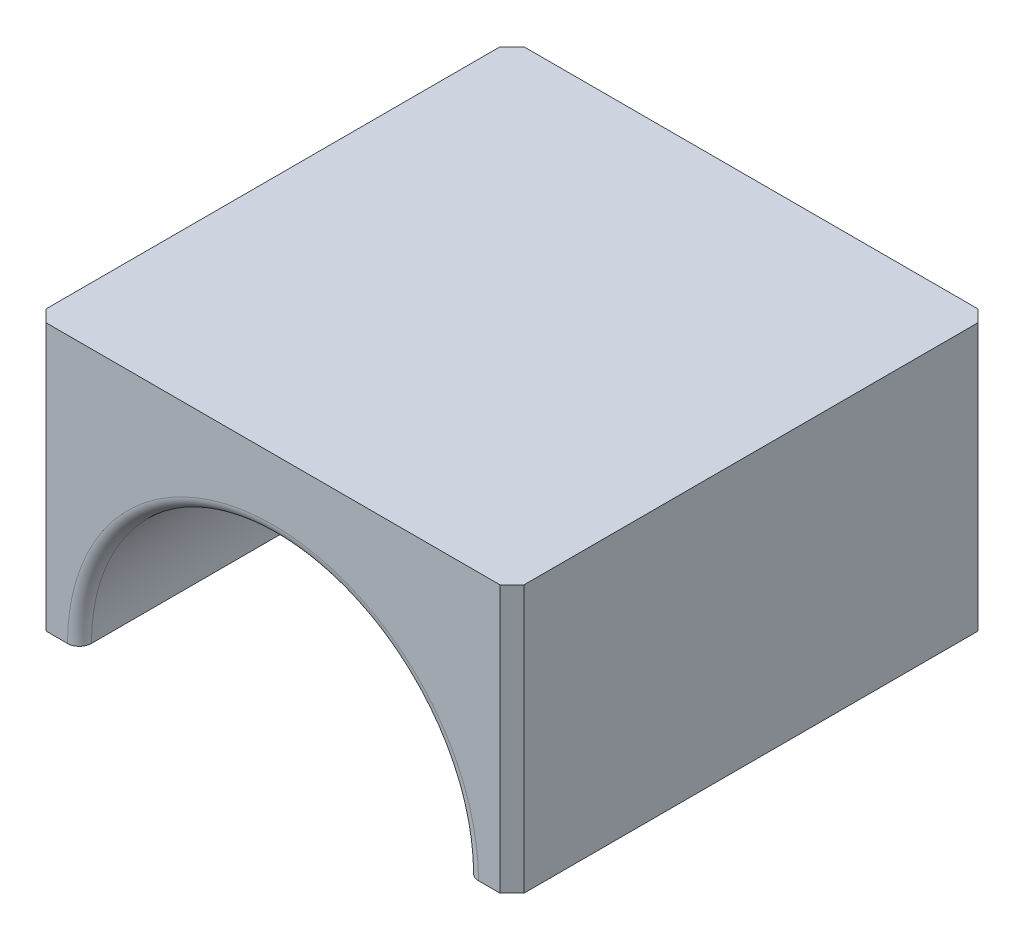
ISO-10303-21;
HEADER;
FILE_DESCRIPTION(('STEP AP214'),'2;1');
FILE_NAME('part.step','',(''),(''),'','','');
FILE_SCHEMA(('AUTOMOTIVE_DESIGN { 1 0 10303 214 1 1 1 1 }'));
ENDSEC;
DATA;
#1=APPLICATION_CONTEXT('core data for automotive mechanical design processes');
#2=APPLICATION_PROTOCOL_DEFINITION('international standard','automotive_design',2000,#1);
#3=PRODUCT_CONTEXT('',#1,'mechanical');
#4=PRODUCT('Part','Part','',(#3));
#5=PRODUCT_RELATED_PRODUCT_CATEGORY('part','',(#4));
#6=PRODUCT_DEFINITION_FORMATION('','',#4);
#7=PRODUCT_DEFINITION_CONTEXT('part definition',#1,'design');
#8=PRODUCT_DEFINITION('design','',#6,#7);
#9=PRODUCT_DEFINITION_SHAPE('','',#8);
#10=(LENGTH_UNIT() NAMED_UNIT(*) SI_UNIT(.MILLI.,.METRE.));
#11=(NAMED_UNIT(*) PLANE_ANGLE_UNIT() SI_UNIT($,.RADIAN.));
#12=(NAMED_UNIT(*) SI_UNIT($,.STERADIAN.) SOLID_ANGLE_UNIT());
#13=UNCERTAINTY_MEASURE_WITH_UNIT(LENGTH_MEASURE(1.E-05),#10,'distance_accuracy_value','');
#14=(GEOMETRIC_REPRESENTATION_CONTEXT(3) GLOBAL_UNCERTAINTY_ASSIGNED_CONTEXT((#13)) GLOBAL_UNIT_ASSIGNED_CONTEXT((#10,
#11,#12)) REPRESENTATION_CONTEXT('',''));
#15=CARTESIAN_POINT('',(0.,0.,0.));
#16=DIRECTION('',(0.,0.,1.));
#17=DIRECTION('',(1.,0.,0.));
#18=AXIS2_PLACEMENT_3D('',#15,#16,#17);
#19=CARTESIAN_POINT('',(10.,1.5875,20.));
#20=DIRECTION('',(-1.,0.,0.));
#21=DIRECTION('',(0.,-1.,0.));
#22=AXIS2_PLACEMENT_3D('',#19,#20,#21);
#23=PLANE('',#22);
#24=DIRECTION('',(0.,0.,-1.));
#25=VECTOR('',#24,1.);
#26=CARTESIAN_POINT('',(10.,1.5875,20.));
#27=LINE('',#26,#25);
#28=CARTESIAN_POINT('',(10.,1.5875,19.5));
#29=VERTEX_POINT('',#28);
#30=CARTESIAN_POINT('',(10.,1.5875,0.500000000000004));
#31=VERTEX_POINT('',#30);
#32=EDGE_CURVE('E156',#29,#31,#27,.T.);
#33=ORIENTED_EDGE('',*,*,#32,.F.);
#34=DIRECTION('',(0.,-1.,0.));
#35=VECTOR('',#34,1.);
#36=CARTESIAN_POINT('',(9.99999999999999,-9.5875,19.5));
#37=LINE('',#36,#35);
#38=CARTESIAN_POINT('',(10.,-9.5875,19.5));
#39=VERTEX_POINT('',#38);
#40=EDGE_CURVE('E62',#29,#39,#37,.T.);
#41=ORIENTED_EDGE('',*,*,#40,.T.);
#42=DIRECTION('',(0.,0.,-1.));
#43=VECTOR('',#42,1.);
#44=CARTESIAN_POINT('',(10.,-9.5875,20.));
#45=LINE('',#44,#43);
#46=CARTESIAN_POINT('',(10.,-9.5875,0.500000000000004));
#47=VERTEX_POINT('',#46);
#48=EDGE_CURVE('E150',#39,#47,#45,.T.);
#49=ORIENTED_EDGE('',*,*,#48,.T.);
#50=DIRECTION('',(0.,1.,0.));
#51=VECTOR('',#50,1.);
#52=CARTESIAN_POINT('',(10.,1.5875,0.500000000000004));
#53=LINE('',#52,#51);
#54=EDGE_CURVE('E200',#47,#31,#53,.T.);
#55=ORIENTED_EDGE('',*,*,#54,.T.);
#56=EDGE_LOOP('',(#33,#41,#49,#55));
#57=FACE_BOUND('',#56,.T.);
#58=ADVANCED_FACE('F40',(#57),#23,.F.);
#59=CARTESIAN_POINT('',(-10.,1.5875,20.));
#60=DIRECTION('',(0.,-1.,0.));
#61=DIRECTION('',(0.,0.,-1.));
#62=AXIS2_PLACEMENT_3D('',#59,#60,#61);
#63=PLANE('',#62);
#64=DIRECTION('',(0.,0.,-1.));
#65=VECTOR('',#64,1.);
#66=CARTESIAN_POINT('',(-10.,1.5875,20.));
#67=LINE('',#66,#65);
#68=CARTESIAN_POINT('',(-10.,1.5875,19.5));
#69=VERTEX_POINT('',#68);
#70=CARTESIAN_POINT('',(-10.,1.5875,0.500000000000004));
#71=VERTEX_POINT('',#70);
#72=EDGE_CURVE('E160',#69,#71,#67,.T.);
#73=ORIENTED_EDGE('',*,*,#72,.F.);
#74=DIRECTION('',(0.707106781186548,0.,0.707106781186548));
#75=VECTOR('',#74,1.);
#76=CARTESIAN_POINT('',(-9.5,1.5875,20.));
#77=LINE('',#76,#75);
#78=CARTESIAN_POINT('',(-9.5,1.5875,20.));
#79=VERTEX_POINT('',#78);
#80=EDGE_CURVE('E194',#69,#79,#77,.T.);
#81=ORIENTED_EDGE('',*,*,#80,.T.);
#82=DIRECTION('',(-1.,0.,0.));
#83=VECTOR('',#82,1.);
#84=CARTESIAN_POINT('',(-10.,1.5875,20.));
#85=LINE('',#84,#83);
#86=CARTESIAN_POINT('',(9.5,1.5875,20.));
#87=VERTEX_POINT('',#86);
#88=EDGE_CURVE('E212',#87,#79,#85,.T.);
#89=ORIENTED_EDGE('',*,*,#88,.F.);
#90=DIRECTION('',(0.707106781186548,0.,-0.707106781186547));
#91=VECTOR('',#90,1.);
#92=CARTESIAN_POINT('',(9.5,1.5875,20.));
#93=LINE('',#92,#91);
#94=EDGE_CURVE('E190',#87,#29,#93,.T.);
#95=ORIENTED_EDGE('',*,*,#94,.T.);
#96=ORIENTED_EDGE('',*,*,#32,.T.);
#97=DIRECTION('',(0.707106781186551,0.,0.707106781186545));
#98=VECTOR('',#97,1.);
#99=CARTESIAN_POINT('',(10.,1.5875,0.500000000000004));
#100=LINE('',#99,#98);
#101=CARTESIAN_POINT('',(9.49999999999999,1.5875,0.));
#102=VERTEX_POINT('',#101);
#103=EDGE_CURVE('E188',#31,#102,#100,.F.);
#104=ORIENTED_EDGE('',*,*,#103,.T.);
#105=DIRECTION('',(-1.,0.,0.));
#106=VECTOR('',#105,1.);
#107=CARTESIAN_POINT('',(-10.,1.5875,0.));
#108=LINE('',#107,#106);
#109=CARTESIAN_POINT('',(-9.49999999999999,1.5875,0.));
#110=VERTEX_POINT('',#109);
#111=EDGE_CURVE('E226',#102,#110,#108,.T.);
#112=ORIENTED_EDGE('',*,*,#111,.T.);
#113=DIRECTION('',(0.70710678118655,0.,-0.707106781186545));
#114=VECTOR('',#113,1.);
#115=CARTESIAN_POINT('',(-10.,1.5875,0.500000000000004));
#116=LINE('',#115,#114);
#117=EDGE_CURVE('E192',#110,#71,#116,.F.);
#118=ORIENTED_EDGE('',*,*,#117,.T.);
#119=EDGE_LOOP('',(#73,#81,#89,#95,#96,#104,#112,#118));
#120=FACE_BOUND('',#119,.T.);
#121=ADVANCED_FACE('F207',(#120),#63,.F.);
#122=CARTESIAN_POINT('',(-10.,-1.5875,20.));
#123=DIRECTION('',(1.,0.,0.));
#124=DIRECTION('',(0.,0.,-1.));
#125=AXIS2_PLACEMENT_3D('',#122,#123,#124);
#126=PLANE('',#125);
#127=DIRECTION('',(0.,0.,-1.));
#128=VECTOR('',#127,1.);
#129=CARTESIAN_POINT('',(-10.,-9.5875,20.));
#130=LINE('',#129,#128);
#131=CARTESIAN_POINT('',(-10.,-9.5875,19.5));
#132=VERTEX_POINT('',#131);
#133=CARTESIAN_POINT('',(-10.,-9.5875,0.500000000000004));
#134=VERTEX_POINT('',#133);
#135=EDGE_CURVE('E233',#132,#134,#130,.T.);
#136=ORIENTED_EDGE('',*,*,#135,.F.);
#137=DIRECTION('',(0.,1.,0.));
#138=VECTOR('',#137,1.);
#139=CARTESIAN_POINT('',(-10.,1.5875,19.5));
#140=LINE('',#139,#138);
#141=EDGE_CURVE('E186',#132,#69,#140,.T.);
#142=ORIENTED_EDGE('',*,*,#141,.T.);
#143=ORIENTED_EDGE('',*,*,#72,.T.);
#144=DIRECTION('',(0.,-1.,0.));
#145=VECTOR('',#144,1.);
#146=CARTESIAN_POINT('',(-10.,-1.5875,0.500000000000004));
#147=LINE('',#146,#145);
#148=EDGE_CURVE('E183',#71,#134,#147,.T.);
#149=ORIENTED_EDGE('',*,*,#148,.T.);
#150=EDGE_LOOP('',(#136,#142,#143,#149));
#151=FACE_BOUND('',#150,.T.);
#152=ADVANCED_FACE('F239',(#151),#126,.F.);
#153=CARTESIAN_POINT('',(-10.,-9.5875,20.));
#154=DIRECTION('',(0.,1.,0.));
#155=DIRECTION('',(0.,0.,1.));
#156=AXIS2_PLACEMENT_3D('',#153,#154,#155);
#157=PLANE('',#156);
#158=DIRECTION('',(1.,0.,0.));
#159=VECTOR('',#158,1.);
#160=CARTESIAN_POINT('',(-10.,-9.5875,20.));
#161=LINE('',#160,#159);
#162=CARTESIAN_POINT('',(-9.5,-9.5875,20.));
#163=VERTEX_POINT('',#162);
#164=CARTESIAN_POINT('',(-8.6,-9.5875,20.));
#165=VERTEX_POINT('',#164);
#166=EDGE_CURVE('E220',#163,#165,#161,.T.);
#167=ORIENTED_EDGE('',*,*,#166,.F.);
#168=DIRECTION('',(-0.707106781186548,0.,-0.707106781186548));
#169=VECTOR('',#168,1.);
#170=CARTESIAN_POINT('',(-9.5,-9.5875,20.));
#171=LINE('',#170,#169);
#172=EDGE_CURVE('E181',#163,#132,#171,.T.);
#173=ORIENTED_EDGE('',*,*,#172,.T.);
#174=ORIENTED_EDGE('',*,*,#135,.T.);
#175=DIRECTION('',(-0.70710678118655,0.,0.707106781186545));
#176=VECTOR('',#175,1.);
#177=CARTESIAN_POINT('',(-10.,-9.5875,0.500000000000004));
#178=LINE('',#177,#176);
#179=CARTESIAN_POINT('',(-9.49999999999999,-9.5875,0.));
#180=VERTEX_POINT('',#179);
#181=EDGE_CURVE('E179',#134,#180,#178,.F.);
#182=ORIENTED_EDGE('',*,*,#181,.T.);
#183=DIRECTION('',(1.,0.,0.));
#184=VECTOR('',#183,1.);
#185=CARTESIAN_POINT('',(-10.,-9.5875,0.));
#186=LINE('',#185,#184);
#187=CARTESIAN_POINT('',(-8.6,-9.5875,0.));
#188=VERTEX_POINT('',#187);
#189=EDGE_CURVE('E228',#180,#188,#186,.T.);
#190=ORIENTED_EDGE('',*,*,#189,.T.);
#191=CARTESIAN_POINT('',(-8.6,-9.5875,0.5));
#192=DIRECTION('',(0.,1.,0.));
#193=DIRECTION('',(0.,0.,1.));
#194=AXIS2_PLACEMENT_3D('',#191,#192,#193);
#195=CIRCLE('',#194,0.5);
#196=CARTESIAN_POINT('',(-8.1,-9.5875,0.5));
#197=VERTEX_POINT('',#196);
#198=EDGE_CURVE('E169',#188,#197,#195,.F.);
#199=ORIENTED_EDGE('',*,*,#198,.T.);
#200=DIRECTION('',(0.,0.,-1.));
#201=VECTOR('',#200,1.);
#202=CARTESIAN_POINT('',(-8.1,-9.5875,20.));
#203=LINE('',#202,#201);
#204=CARTESIAN_POINT('',(-8.1,-9.5875,19.5));
#205=VERTEX_POINT('',#204);
#206=EDGE_CURVE('E149',#205,#197,#203,.T.);
#207=ORIENTED_EDGE('',*,*,#206,.F.);
#208=CARTESIAN_POINT('',(-8.6,-9.5875,19.5));
#209=DIRECTION('',(0.,1.,0.));
#210=DIRECTION('',(0.,0.,1.));
#211=AXIS2_PLACEMENT_3D('',#208,#209,#210);
#212=CIRCLE('',#211,0.5);
#213=EDGE_CURVE('E155',#205,#165,#212,.F.);
#214=ORIENTED_EDGE('',*,*,#213,.T.);
#215=EDGE_LOOP('',(#167,#173,#174,#182,#190,#199,#207,#214));
#216=FACE_BOUND('',#215,.T.);
#217=ADVANCED_FACE('F249',(#216),#157,.F.);
#218=CARTESIAN_POINT('',(0.,-9.5875,20.));
#219=DIRECTION('',(0.,0.,-1.));
#220=DIRECTION('',(-1.,0.,0.));
#221=AXIS2_PLACEMENT_3D('',#218,#219,#220);
#222=CYLINDRICAL_SURFACE('',#221,8.1);
#223=ORIENTED_EDGE('',*,*,#206,.T.);
#224=CARTESIAN_POINT('',(0.,-9.5875,0.5));
#225=DIRECTION('',(0.,0.,1.));
#226=DIRECTION('',(1.,0.,0.));
#227=AXIS2_PLACEMENT_3D('',#224,#225,#226);
#228=CIRCLE('',#227,8.1);
#229=CARTESIAN_POINT('',(8.1,-9.5875,0.5));
#230=VERTEX_POINT('',#229);
#231=EDGE_CURVE('E140',#197,#230,#228,.F.);
#232=ORIENTED_EDGE('',*,*,#231,.T.);
#233=DIRECTION('',(0.,0.,-1.));
#234=VECTOR('',#233,1.);
#235=CARTESIAN_POINT('',(8.1,-9.5875,20.));
#236=LINE('',#235,#234);
#237=CARTESIAN_POINT('',(8.1,-9.5875,19.5));
#238=VERTEX_POINT('',#237);
#239=EDGE_CURVE('E132',#238,#230,#236,.T.);
#240=ORIENTED_EDGE('',*,*,#239,.F.);
#241=CARTESIAN_POINT('',(0.,-9.5875,19.5));
#242=DIRECTION('',(0.,0.,1.));
#243=DIRECTION('',(1.,0.,0.));
#244=AXIS2_PLACEMENT_3D('',#241,#242,#243);
#245=CIRCLE('',#244,8.1);
#246=EDGE_CURVE('E146',#238,#205,#245,.T.);
#247=ORIENTED_EDGE('',*,*,#246,.T.);
#248=EDGE_LOOP('',(#223,#232,#240,#247));
#249=FACE_BOUND('',#248,.T.);
#250=ADVANCED_FACE('F145',(#249),#222,.F.);
#251=CARTESIAN_POINT('',(8.1,-9.5875,20.));
#252=DIRECTION('',(0.,1.,0.));
#253=DIRECTION('',(0.,0.,1.));
#254=AXIS2_PLACEMENT_3D('',#251,#252,#253);
#255=PLANE('',#254);
#256=ORIENTED_EDGE('',*,*,#48,.F.);
#257=DIRECTION('',(-0.707106781186548,0.,0.707106781186547));
#258=VECTOR('',#257,1.);
#259=CARTESIAN_POINT('',(9.49999999999999,-9.58750000000001,20.));
#260=LINE('',#259,#258);
#261=CARTESIAN_POINT('',(9.49999999999999,-9.5875,20.));
#262=VERTEX_POINT('',#261);
#263=EDGE_CURVE('E11',#39,#262,#260,.T.);
#264=ORIENTED_EDGE('',*,*,#263,.T.);
#265=DIRECTION('',(1.,0.,0.));
#266=VECTOR('',#265,1.);
#267=CARTESIAN_POINT('',(8.1,-9.5875,20.));
#268=LINE('',#267,#266);
#269=CARTESIAN_POINT('',(8.6,-9.5875,20.));
#270=VERTEX_POINT('',#269);
#271=EDGE_CURVE('E134',#270,#262,#268,.T.);
#272=ORIENTED_EDGE('',*,*,#271,.F.);
#273=CARTESIAN_POINT('',(8.6,-9.5875,19.5));
#274=DIRECTION('',(0.,1.,0.));
#275=DIRECTION('',(0.,0.,1.));
#276=AXIS2_PLACEMENT_3D('',#273,#274,#275);
#277=CIRCLE('',#276,0.5);
#278=EDGE_CURVE('E129',#270,#238,#277,.F.);
#279=ORIENTED_EDGE('',*,*,#278,.T.);
#280=ORIENTED_EDGE('',*,*,#239,.T.);
#281=CARTESIAN_POINT('',(8.6,-9.5875,0.5));
#282=DIRECTION('',(0.,1.,0.));
#283=DIRECTION('',(0.,0.,1.));
#284=AXIS2_PLACEMENT_3D('',#281,#282,#283);
#285=CIRCLE('',#284,0.5);
#286=CARTESIAN_POINT('',(8.6,-9.5875,0.));
#287=VERTEX_POINT('',#286);
#288=EDGE_CURVE('E139',#230,#287,#285,.F.);
#289=ORIENTED_EDGE('',*,*,#288,.T.);
#290=DIRECTION('',(1.,0.,0.));
#291=VECTOR('',#290,1.);
#292=CARTESIAN_POINT('',(8.1,-9.5875,0.));
#293=LINE('',#292,#291);
#294=CARTESIAN_POINT('',(9.49999999999999,-9.5875,0.));
#295=VERTEX_POINT('',#294);
#296=EDGE_CURVE('E230',#287,#295,#293,.T.);
#297=ORIENTED_EDGE('',*,*,#296,.T.);
#298=DIRECTION('',(-0.707106781186551,0.,-0.707106781186545));
#299=VECTOR('',#298,1.);
#300=CARTESIAN_POINT('',(10.,-9.5875,0.500000000000007));
#301=LINE('',#300,#299);
#302=EDGE_CURVE('E49',#295,#47,#301,.F.);
#303=ORIENTED_EDGE('',*,*,#302,.T.);
#304=EDGE_LOOP('',(#256,#264,#272,#279,#280,#289,#297,#303));
#305=FACE_BOUND('',#304,.T.);
#306=ADVANCED_FACE('F131',(#305),#255,.F.);
#307=CARTESIAN_POINT('',(0.,-9.5875,20.));
#308=DIRECTION('',(0.,0.,1.));
#309=DIRECTION('',(1.,0.,0.));
#310=AXIS2_PLACEMENT_3D('',#307,#308,#309);
#311=PLANE('',#310);
#312=ORIENTED_EDGE('',*,*,#88,.T.);
#313=DIRECTION('',(0.,-1.,0.));
#314=VECTOR('',#313,1.);
#315=CARTESIAN_POINT('',(-9.5,-9.5875,20.));
#316=LINE('',#315,#314);
#317=EDGE_CURVE('E176',#79,#163,#316,.T.);
#318=ORIENTED_EDGE('',*,*,#317,.T.);
#319=ORIENTED_EDGE('',*,*,#166,.T.);
#320=CARTESIAN_POINT('',(0.,-9.5875,20.));
#321=DIRECTION('',(0.,0.,1.));
#322=DIRECTION('',(1.,0.,0.));
#323=AXIS2_PLACEMENT_3D('',#320,#321,#322);
#324=CIRCLE('',#323,8.6);
#325=EDGE_CURVE('E171',#165,#270,#324,.F.);
#326=ORIENTED_EDGE('',*,*,#325,.T.);
#327=ORIENTED_EDGE('',*,*,#271,.T.);
#328=DIRECTION('',(0.,1.,0.));
#329=VECTOR('',#328,1.);
#330=CARTESIAN_POINT('',(9.5,1.5875,20.));
#331=LINE('',#330,#329);
#332=EDGE_CURVE('E173',#262,#87,#331,.T.);
#333=ORIENTED_EDGE('',*,*,#332,.T.);
#334=EDGE_LOOP('',(#312,#318,#319,#326,#327,#333));
#335=FACE_BOUND('',#334,.T.);
#336=ADVANCED_FACE('F218',(#335),#311,.T.);
#337=CARTESIAN_POINT('',(0.,-9.5875,0.));
#338=DIRECTION('',(0.,0.,1.));
#339=DIRECTION('',(1.,0.,0.));
#340=AXIS2_PLACEMENT_3D('',#337,#338,#339);
#341=PLANE('',#340);
#342=ORIENTED_EDGE('',*,*,#189,.F.);
#343=DIRECTION('',(0.,1.,0.));
#344=VECTOR('',#343,1.);
#345=CARTESIAN_POINT('',(-9.49999999999999,-9.5875,0.));
#346=LINE('',#345,#344);
#347=EDGE_CURVE('E198',#180,#110,#346,.T.);
#348=ORIENTED_EDGE('',*,*,#347,.T.);
#349=ORIENTED_EDGE('',*,*,#111,.F.);
#350=DIRECTION('',(0.,-1.,0.));
#351=VECTOR('',#350,1.);
#352=CARTESIAN_POINT('',(9.49999999999999,-9.58750000000001,0.));
#353=LINE('',#352,#351);
#354=EDGE_CURVE('E196',#102,#295,#353,.T.);
#355=ORIENTED_EDGE('',*,*,#354,.T.);
#356=ORIENTED_EDGE('',*,*,#296,.F.);
#357=CARTESIAN_POINT('',(0.,-9.5875,0.));
#358=DIRECTION('',(0.,0.,1.));
#359=DIRECTION('',(1.,0.,0.));
#360=AXIS2_PLACEMENT_3D('',#357,#358,#359);
#361=CIRCLE('',#360,8.6);
#362=EDGE_CURVE('E165',#287,#188,#361,.T.);
#363=ORIENTED_EDGE('',*,*,#362,.T.);
#364=EDGE_LOOP('',(#342,#348,#349,#355,#356,#363));
#365=FACE_BOUND('',#364,.T.);
#366=ADVANCED_FACE('F251',(#365),#341,.F.);
#367=CARTESIAN_POINT('',(0.,-9.5875,0.5));
#368=DIRECTION('',(0.,0.,1.));
#369=DIRECTION('',(1.,0.,0.));
#370=AXIS2_PLACEMENT_3D('',#367,#368,#369);
#371=TOROIDAL_SURFACE('',#370,8.6,0.5);
#372=ORIENTED_EDGE('',*,*,#198,.F.);
#373=ORIENTED_EDGE('',*,*,#362,.F.);
#374=ORIENTED_EDGE('',*,*,#288,.F.);
#375=ORIENTED_EDGE('',*,*,#231,.F.);
#376=EDGE_LOOP('',(#372,#373,#374,#375));
#377=FACE_BOUND('',#376,.T.);
#378=ADVANCED_FACE('F256',(#377),#371,.T.);
#379=CARTESIAN_POINT('',(0.,-9.5875,19.5));
#380=DIRECTION('',(0.,0.,1.));
#381=DIRECTION('',(1.,0.,0.));
#382=AXIS2_PLACEMENT_3D('',#379,#380,#381);
#383=TOROIDAL_SURFACE('',#382,8.6,0.5);
#384=ORIENTED_EDGE('',*,*,#213,.F.);
#385=ORIENTED_EDGE('',*,*,#246,.F.);
#386=ORIENTED_EDGE('',*,*,#278,.F.);
#387=ORIENTED_EDGE('',*,*,#325,.F.);
#388=EDGE_LOOP('',(#384,#385,#386,#387));
#389=FACE_BOUND('',#388,.T.);
#390=ADVANCED_FACE('F153',(#389),#383,.T.);
#391=CARTESIAN_POINT('',(-9.5,-9.5875,20.));
#392=DIRECTION('',(-0.707106781186547,0.,0.707106781186547));
#393=DIRECTION('',(0.,1.,0.));
#394=AXIS2_PLACEMENT_3D('',#391,#392,#393);
#395=PLANE('',#394);
#396=ORIENTED_EDGE('',*,*,#80,.F.);
#397=ORIENTED_EDGE('',*,*,#141,.F.);
#398=ORIENTED_EDGE('',*,*,#172,.F.);
#399=ORIENTED_EDGE('',*,*,#317,.F.);
#400=EDGE_LOOP('',(#396,#397,#398,#399));
#401=FACE_BOUND('',#400,.T.);
#402=ADVANCED_FACE('F258',(#401),#395,.T.);
#403=CARTESIAN_POINT('',(-10.,-1.5875,0.500000000000004));
#404=DIRECTION('',(0.707106781186545,0.,0.70710678118655));
#405=DIRECTION('',(0.,-1.,0.));
#406=AXIS2_PLACEMENT_3D('',#403,#404,#405);
#407=PLANE('',#406);
#408=ORIENTED_EDGE('',*,*,#117,.F.);
#409=ORIENTED_EDGE('',*,*,#347,.F.);
#410=ORIENTED_EDGE('',*,*,#181,.F.);
#411=ORIENTED_EDGE('',*,*,#148,.F.);
#412=EDGE_LOOP('',(#408,#409,#410,#411));
#413=FACE_BOUND('',#412,.T.);
#414=ADVANCED_FACE('F244',(#413),#407,.F.);
#415=CARTESIAN_POINT('',(9.49999999999999,-9.58750000000001,20.));
#416=DIRECTION('',(0.707106781186547,0.,0.707106781186548));
#417=DIRECTION('',(0.,-1.,0.));
#418=AXIS2_PLACEMENT_3D('',#415,#416,#417);
#419=PLANE('',#418);
#420=ORIENTED_EDGE('',*,*,#263,.F.);
#421=ORIENTED_EDGE('',*,*,#40,.F.);
#422=ORIENTED_EDGE('',*,*,#94,.F.);
#423=ORIENTED_EDGE('',*,*,#332,.F.);
#424=EDGE_LOOP('',(#420,#421,#422,#423));
#425=FACE_BOUND('',#424,.T.);
#426=ADVANCED_FACE('F216',(#425),#419,.T.);
#427=CARTESIAN_POINT('',(10.,1.5875,0.500000000000004));
#428=DIRECTION('',(-0.707106781186545,0.,0.707106781186551));
#429=DIRECTION('',(0.,1.,0.));
#430=AXIS2_PLACEMENT_3D('',#427,#428,#429);
#431=PLANE('',#430);
#432=ORIENTED_EDGE('',*,*,#302,.F.);
#433=ORIENTED_EDGE('',*,*,#354,.F.);
#434=ORIENTED_EDGE('',*,*,#103,.F.);
#435=ORIENTED_EDGE('',*,*,#54,.F.);
#436=EDGE_LOOP('',(#432,#433,#434,#435));
#437=FACE_BOUND('',#436,.T.);
#438=ADVANCED_FACE('F43',(#437),#431,.F.);
#439=CLOSED_SHELL('',(#58,#121,#152,#217,#250,#306,#336,#366,#378,#390,#402,#414,#426,#438));
#440=MANIFOLD_SOLID_BREP('B2',#439);
#441=ADVANCED_BREP_SHAPE_REPRESENTATION('',(#18,#440),#14);
#442=SHAPE_DEFINITION_REPRESENTATION(#9,#441);
ENDSEC;
END-ISO-10303-21;
